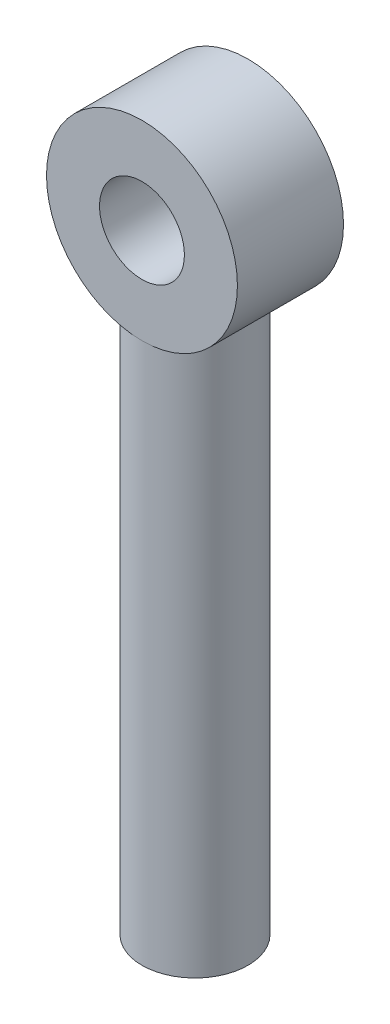
ISO-10303-21;
HEADER;
FILE_DESCRIPTION(('STEP AP214'),'2;1');
FILE_NAME('part.step','',(''),(''),'','','');
FILE_SCHEMA(('AUTOMOTIVE_DESIGN { 1 0 10303 214 1 1 1 1 }'));
ENDSEC;
DATA;
#1=APPLICATION_CONTEXT('core data for automotive mechanical design processes');
#2=APPLICATION_PROTOCOL_DEFINITION('international standard','automotive_design',2000,#1);
#3=PRODUCT_CONTEXT('',#1,'mechanical');
#4=PRODUCT('Part','Part','',(#3));
#5=PRODUCT_RELATED_PRODUCT_CATEGORY('part','',(#4));
#6=PRODUCT_DEFINITION_FORMATION('','',#4);
#7=PRODUCT_DEFINITION_CONTEXT('part definition',#1,'design');
#8=PRODUCT_DEFINITION('design','',#6,#7);
#9=PRODUCT_DEFINITION_SHAPE('','',#8);
#10=(LENGTH_UNIT() NAMED_UNIT(*) SI_UNIT(.MILLI.,.METRE.));
#11=(NAMED_UNIT(*) PLANE_ANGLE_UNIT() SI_UNIT($,.RADIAN.));
#12=(NAMED_UNIT(*) SI_UNIT($,.STERADIAN.) SOLID_ANGLE_UNIT());
#13=UNCERTAINTY_MEASURE_WITH_UNIT(LENGTH_MEASURE(1.E-05),#10,'distance_accuracy_value','');
#14=(GEOMETRIC_REPRESENTATION_CONTEXT(3) GLOBAL_UNCERTAINTY_ASSIGNED_CONTEXT((#13)) GLOBAL_UNIT_ASSIGNED_CONTEXT((#10,
#11,#12)) REPRESENTATION_CONTEXT('',''));
#15=CARTESIAN_POINT('',(0.,0.,0.));
#16=DIRECTION('',(0.,0.,1.));
#17=DIRECTION('',(1.,0.,0.));
#18=AXIS2_PLACEMENT_3D('',#15,#16,#17);
#19=CARTESIAN_POINT('',(9.00000000000005,-20.,-23.5));
#20=DIRECTION('',(0.,0.,-1.));
#21=DIRECTION('',(-1.,0.,0.));
#22=AXIS2_PLACEMENT_3D('',#19,#20,#21);
#23=CYLINDRICAL_SURFACE('',#22,4.5);
#24=CARTESIAN_POINT('',(9.00000000000005,-20.,-28.5));
#25=DIRECTION('',(0.,0.,-1.));
#26=DIRECTION('',(-1.,0.,0.));
#27=AXIS2_PLACEMENT_3D('',#24,#25,#26);
#28=CIRCLE('',#27,4.5);
#29=CARTESIAN_POINT('',(9.00000000000005,-24.5,-28.5));
#30=VERTEX_POINT('',#29);
#31=EDGE_CURVE('E40',#30,#30,#28,.T.);
#32=ORIENTED_EDGE('',*,*,#31,.F.);
#33=CARTESIAN_POINT('',(9.00000000000005,-24.5,-23.5));
#34=CARTESIAN_POINT('',(8.87024190979238,-24.5000031446533,-23.4999963348088));
#35=CARTESIAN_POINT('',(8.74050495195359,-24.4943396990033,-23.5101465703569));
#36=CARTESIAN_POINT('',(8.4850639057609,-24.4722793076248,-23.5501918614718));
#37=CARTESIAN_POINT('',(8.35936057038263,-24.455880369938,-23.5800905813565));
#38=CARTESIAN_POINT('',(8.11591266305848,-24.4140242705976,-23.6580601570653));
#39=CARTESIAN_POINT('',(7.99814070400175,-24.3886004059786,-23.7060642541223));
#40=CARTESIAN_POINT('',(7.77254028241985,-24.3309257707018,-23.8184316688641));
#41=CARTESIAN_POINT('',(7.66471421764041,-24.2986733599687,-23.8827989173853));
#42=CARTESIAN_POINT('',(7.45366384856412,-24.227539814377,-24.0310866825029));
#43=CARTESIAN_POINT('',(7.35128094443904,-24.18835368821,-24.1160556477388));
#44=CARTESIAN_POINT('',(7.16141197240736,-24.1085547345552,-24.3008326673667));
#45=CARTESIAN_POINT('',(7.07394111882074,-24.0679405003568,-24.4006556847828));
#46=CARTESIAN_POINT('',(6.90742936097767,-23.9850524639504,-24.6243152102312));
#47=CARTESIAN_POINT('',(6.83014117865375,-23.9430276119272,-24.7495601012071));
#48=CARTESIAN_POINT('',(6.69806317384837,-23.8674169061942,-25.0136913912745));
#49=CARTESIAN_POINT('',(6.64324114183153,-23.8338189978644,-25.1525579043849));
#50=CARTESIAN_POINT('',(6.5677178016794,-23.7862330176154,-25.4100572229476));
#51=CARTESIAN_POINT('',(6.54226721765065,-23.7696077671525,-25.5268096785923));
#52=CARTESIAN_POINT('',(6.50832129059214,-23.7472616507517,-25.7637356391159));
#53=CARTESIAN_POINT('',(6.49980923424352,-23.7415300362668,-25.8839056529721));
#54=CARTESIAN_POINT('',(6.50019754765257,-23.7417892685012,-26.1243310951725));
#55=CARTESIAN_POINT('',(6.50911698459427,-23.7477929517055,-26.2445864730569));
#56=CARTESIAN_POINT('',(6.54389552085529,-23.7706719651853,-26.4815779384004));
#57=CARTESIAN_POINT('',(6.5697656351876,-23.7875543646296,-26.5983116857756));
#58=CARTESIAN_POINT('',(6.63722349290663,-23.8299942419216,-26.8254322479932));
#59=CARTESIAN_POINT('',(6.67881473080387,-23.8555536483762,-26.9358176454268));
#60=CARTESIAN_POINT('',(6.77629743156264,-23.9125860612172,-27.1484075238548));
#61=CARTESIAN_POINT('',(6.83219447973427,-23.9440613760294,-27.2506087890724));
#62=CARTESIAN_POINT('',(6.9665356506257,-24.0151749652354,-27.4604132953392));
#63=CARTESIAN_POINT('',(7.04711529389316,-24.0553268516825,-27.5664772534173));
#64=CARTESIAN_POINT('',(7.22403174797166,-24.1358669347814,-27.764536952633));
#65=CARTESIAN_POINT('',(7.32038099390028,-24.1762552934712,-27.8565214797606));
#66=CARTESIAN_POINT('',(7.53786099830674,-24.2575740911411,-28.0331489503057));
#67=CARTESIAN_POINT('',(7.66051383892861,-24.2981443774521,-28.1161021921216));
#68=CARTESIAN_POINT('',(7.92052197387606,-24.3706855505918,-28.2598105487437));
#69=CARTESIAN_POINT('',(8.05786751287922,-24.4026620943603,-28.3205802756164));
#70=CARTESIAN_POINT('',(8.33325197384449,-24.452370934889,-28.4135108358526));
#71=CARTESIAN_POINT('',(8.4705511156694,-24.4709525095323,-28.4473947693908));
#72=CARTESIAN_POINT('',(8.74997581303277,-24.4952296122401,-28.4914737052443));
#73=CARTESIAN_POINT('',(8.89209699303464,-24.5009365213435,-28.5016896299907));
#74=CARTESIAN_POINT('',(9.1597369920614,-24.4989279141713,-28.4980667811528));
#75=CARTESIAN_POINT('',(9.28531175571394,-24.4926604505994,-28.4868232515407));
#76=CARTESIAN_POINT('',(9.53246138934216,-24.4701096058098,-28.4458481426901));
#77=CARTESIAN_POINT('',(9.65403612920245,-24.4538258991158,-28.4161159626658));
#78=CARTESIAN_POINT('',(9.88962604214755,-24.41280294973,-28.3396286896134));
#79=CARTESIAN_POINT('',(10.0036672751182,-24.3880948987075,-28.2929363515614));
#80=CARTESIAN_POINT('',(10.2224244885981,-24.3322557519242,-28.1841738176502));
#81=CARTESIAN_POINT('',(10.3271379634636,-24.3011229377331,-28.1220995066834));
#82=CARTESIAN_POINT('',(10.5358708210238,-24.2313618421927,-27.9770878081632));
#83=CARTESIAN_POINT('',(10.6387055370768,-24.1922917058087,-27.8926592478118));
#84=CARTESIAN_POINT('',(10.8295391396586,-24.1126031721819,-27.7089069267833));
#85=CARTESIAN_POINT('',(10.9175214943054,-24.0719831105815,-27.6095667975723));
#86=CARTESIAN_POINT('',(11.0851196147033,-23.9889686233733,-27.3869383523853));
#87=CARTESIAN_POINT('',(11.1630001568082,-23.9468075553247,-27.2622457324754));
#88=CARTESIAN_POINT('',(11.2963793260761,-23.8707326279334,-26.9991553416204));
#89=CARTESIAN_POINT('',(11.3519096094174,-23.8368071312363,-26.8607773030221));
#90=CARTESIAN_POINT('',(11.4288888976774,-23.7884190447171,-26.6037830298894));
#91=CARTESIAN_POINT('',(11.455028861399,-23.7713737243324,-26.487058727664));
#92=CARTESIAN_POINT('',(11.4903392572154,-23.7481564558687,-26.2500533626568));
#93=CARTESIAN_POINT('',(11.49952663984,-23.7419736468892,-26.1297759749592));
#94=CARTESIAN_POINT('',(11.5004381909178,-23.7413646249947,-25.8889782428689));
#95=CARTESIAN_POINT('',(11.492140619045,-23.7469530481121,-25.7684577823777));
#96=CARTESIAN_POINT('',(11.4585164317327,-23.7690960964836,-25.5308320147304));
#97=CARTESIAN_POINT('',(11.4331789421246,-23.7856577242819,-25.4137289382289));
#98=CARTESIAN_POINT('',(11.3667948320566,-23.8275053438175,-25.1861811345801));
#99=CARTESIAN_POINT('',(11.3257956726703,-23.8527649546376,-25.0757174466498));
#100=CARTESIAN_POINT('',(11.2294944202125,-23.9092793748766,-24.8628917164795));
#101=CARTESIAN_POINT('',(11.1741868174664,-23.9405364925225,-24.7605328149795));
#102=CARTESIAN_POINT('',(11.041192625485,-24.0112358899459,-24.5504377074239));
#103=CARTESIAN_POINT('',(10.9613896250548,-24.0512018177053,-24.4442155870036));
#104=CARTESIAN_POINT('',(10.7860593103317,-24.1315010676069,-24.245704881965));
#105=CARTESIAN_POINT('',(10.6905192936935,-24.1718346614666,-24.153427669493));
#106=CARTESIAN_POINT('',(10.4744786624672,-24.2533012176501,-23.9757873521318));
#107=CARTESIAN_POINT('',(10.3524149292481,-24.2940802026929,-23.892144354214));
#108=CARTESIAN_POINT('',(10.0934914136631,-24.3671865771867,-23.7469449351922));
#109=CARTESIAN_POINT('',(9.95664252108403,-24.3995201278104,-23.6853724008104));
#110=CARTESIAN_POINT('',(9.6848232276071,-24.4495340821807,-23.5917285619946));
#111=CARTESIAN_POINT('',(9.5507966105149,-24.4682730614373,-23.5574973518624));
#112=CARTESIAN_POINT('',(9.27783596895267,-24.4934995383204,-23.5116438885955));
#113=CARTESIAN_POINT('',(9.13890587597115,-24.4999966336525,-23.5000039235827));
#114=CARTESIAN_POINT('',(9.00000000000005,-24.5,-23.5));
#115=B_SPLINE_CURVE_WITH_KNOTS('',3,(#33,#34,#35,#36,#37,#38,#39,#40,#41,#42,#43,#44,#45,#46,
#47,#48,#49,#50,#51,#52,#53,#54,#55,#56,#57,#58,#59,#60,#61,#62,#63,#64,#65,#66,#67,#68,#69,#70,
#71,#72,#73,#74,#75,#76,#77,#78,#79,#80,#81,#82,#83,#84,#85,#86,#87,#88,#89,#90,#91,#92,#93,#94,
#95,#96,#97,#98,#99,#100,#101,#102,#103,#104,#105,#106,#107,#108,#109,#110,#111,#112,#113,#114),
.UNSPECIFIED.,.T.,.F.,(4,2,2,2,2,2,2,2,2,2,2,2,2,2,2,2,2,2,2,2,2,2,2,2,2,2,2,2,2,2,2,2,2,2,2,2,
2,2,2,2,4),(0.,0.388735550907335,0.777543251702008,1.16493112478047,1.55241214615887,
1.96683794951781,2.38168408101693,2.83857267136893,3.29480391312177,3.65516176649211,
4.01516387654727,4.37555999005167,4.73619053136807,5.0969012812658,5.45775307616217,
5.87344204444458,6.2894603975851,6.74765475008831,7.20554674747981,7.63096944961687,
8.05601593594986,8.43288535066555,8.80976701233836,9.18526813217114,9.56086981770375,
9.97519675058502,10.389981864785,10.846544170616,11.3024575214123,11.6633530399673,
12.0238875107278,12.3848705249248,12.7460841223787,13.1062116731934,13.466478103307,
13.8810342040651,14.2959265740116,14.7540149206223,15.2117681400763,15.6282357181934,
16.0443766473137),.UNSPECIFIED.);
#116=CARTESIAN_POINT('',(9.00000000000005,-24.5,-23.5));
#117=VERTEX_POINT('',#116);
#118=EDGE_CURVE('E46',#117,#30,#115,.T.);
#119=ORIENTED_EDGE('',*,*,#118,.F.);
#120=CARTESIAN_POINT('',(9.00000000000005,-20.,-23.5));
#121=DIRECTION('',(0.,0.,-1.));
#122=DIRECTION('',(-1.,0.,0.));
#123=AXIS2_PLACEMENT_3D('',#120,#121,#122);
#124=CIRCLE('',#123,4.5);
#125=EDGE_CURVE('E11',#117,#117,#124,.T.);
#126=ORIENTED_EDGE('',*,*,#125,.T.);
#127=EDGE_CURVE('E48',#30,#117,#115,.T.);
#128=ORIENTED_EDGE('',*,*,#127,.F.);
#129=EDGE_LOOP('',(#32,#119,#126,#128));
#130=FACE_BOUND('',#129,.T.);
#131=ADVANCED_FACE('F32',(#130),#23,.T.);
#132=CARTESIAN_POINT('',(13.5,-20.,-23.5));
#133=DIRECTION('',(0.,0.,1.));
#134=DIRECTION('',(1.,0.,0.));
#135=AXIS2_PLACEMENT_3D('',#132,#133,#134);
#136=PLANE('',#135);
#137=CARTESIAN_POINT('',(9.00000000000005,-20.,-23.5));
#138=DIRECTION('',(0.,0.,1.));
#139=DIRECTION('',(1.,0.,0.));
#140=AXIS2_PLACEMENT_3D('',#137,#138,#139);
#141=CIRCLE('',#140,1.99999999999999);
#142=CARTESIAN_POINT('',(11.,-20.,-23.5));
#143=VERTEX_POINT('',#142);
#144=EDGE_CURVE('E80',#143,#143,#141,.T.);
#145=ORIENTED_EDGE('',*,*,#144,.F.);
#146=EDGE_LOOP('',(#145));
#147=FACE_BOUND('',#146,.T.);
#148=ORIENTED_EDGE('',*,*,#125,.F.);
#149=EDGE_LOOP('',(#148));
#150=FACE_BOUND('',#149,.T.);
#151=ADVANCED_FACE('F57',(#147,#150),#136,.T.);
#152=CARTESIAN_POINT('',(9.00000000000005,-20.,-28.5));
#153=DIRECTION('',(0.,0.,-1.));
#154=DIRECTION('',(-1.,0.,0.));
#155=AXIS2_PLACEMENT_3D('',#152,#153,#154);
#156=PLANE('',#155);
#157=CARTESIAN_POINT('',(9.00000000000005,-20.,-28.5));
#158=DIRECTION('',(0.,0.,1.));
#159=DIRECTION('',(1.,0.,0.));
#160=AXIS2_PLACEMENT_3D('',#157,#158,#159);
#161=CIRCLE('',#160,1.99999999999999);
#162=CARTESIAN_POINT('',(11.,-20.,-28.5));
#163=VERTEX_POINT('',#162);
#164=EDGE_CURVE('E82',#163,#163,#161,.T.);
#165=ORIENTED_EDGE('',*,*,#164,.T.);
#166=EDGE_LOOP('',(#165));
#167=FACE_BOUND('',#166,.T.);
#168=ORIENTED_EDGE('',*,*,#31,.T.);
#169=EDGE_LOOP('',(#168));
#170=FACE_BOUND('',#169,.T.);
#171=ADVANCED_FACE('F68',(#167,#170),#156,.T.);
#172=CARTESIAN_POINT('',(9.00000000000005,-50.,-26.));
#173=DIRECTION('',(0.,1.,0.));
#174=DIRECTION('',(0.,0.,1.));
#175=AXIS2_PLACEMENT_3D('',#172,#173,#174);
#176=CYLINDRICAL_SURFACE('',#175,2.5);
#177=CARTESIAN_POINT('',(9.00000000000005,-50.,-26.));
#178=DIRECTION('',(0.,1.,0.));
#179=DIRECTION('',(0.,0.,1.));
#180=AXIS2_PLACEMENT_3D('',#177,#178,#179);
#181=CIRCLE('',#180,2.5);
#182=CARTESIAN_POINT('',(9.00000000000005,-50.,-23.5));
#183=VERTEX_POINT('',#182);
#184=EDGE_CURVE('E54',#183,#183,#181,.T.);
#185=ORIENTED_EDGE('',*,*,#184,.T.);
#186=EDGE_LOOP('',(#185));
#187=FACE_BOUND('',#186,.T.);
#188=ORIENTED_EDGE('',*,*,#118,.T.);
#189=ORIENTED_EDGE('',*,*,#127,.T.);
#190=EDGE_LOOP('',(#188,#189));
#191=FACE_BOUND('',#190,.T.);
#192=ADVANCED_FACE('F50',(#187,#191),#176,.T.);
#193=CARTESIAN_POINT('',(9.00000000000005,-50.,-23.5));
#194=DIRECTION('',(0.,-1.,0.));
#195=DIRECTION('',(0.,0.,-1.));
#196=AXIS2_PLACEMENT_3D('',#193,#194,#195);
#197=PLANE('',#196);
#198=ORIENTED_EDGE('',*,*,#184,.F.);
#199=EDGE_LOOP('',(#198));
#200=FACE_BOUND('',#199,.T.);
#201=ADVANCED_FACE('F67',(#200),#197,.T.);
#202=CARTESIAN_POINT('',(9.00000000000005,-20.,-23.5));
#203=DIRECTION('',(0.,0.,1.));
#204=DIRECTION('',(1.,0.,0.));
#205=AXIS2_PLACEMENT_3D('',#202,#203,#204);
#206=CYLINDRICAL_SURFACE('',#205,1.99999999999999);
#207=ORIENTED_EDGE('',*,*,#164,.F.);
#208=EDGE_LOOP('',(#207));
#209=FACE_BOUND('',#208,.T.);
#210=ORIENTED_EDGE('',*,*,#144,.T.);
#211=EDGE_LOOP('',(#210));
#212=FACE_BOUND('',#211,.T.);
#213=ADVANCED_FACE('F90',(#209,#212),#206,.F.);
#214=CLOSED_SHELL('',(#131,#151,#171,#192,#201,#213));
#215=MANIFOLD_SOLID_BREP('B2',#214);
#216=ADVANCED_BREP_SHAPE_REPRESENTATION('',(#18,#215),#14);
#217=SHAPE_DEFINITION_REPRESENTATION(#9,#216);
ENDSEC;
END-ISO-10303-21;
